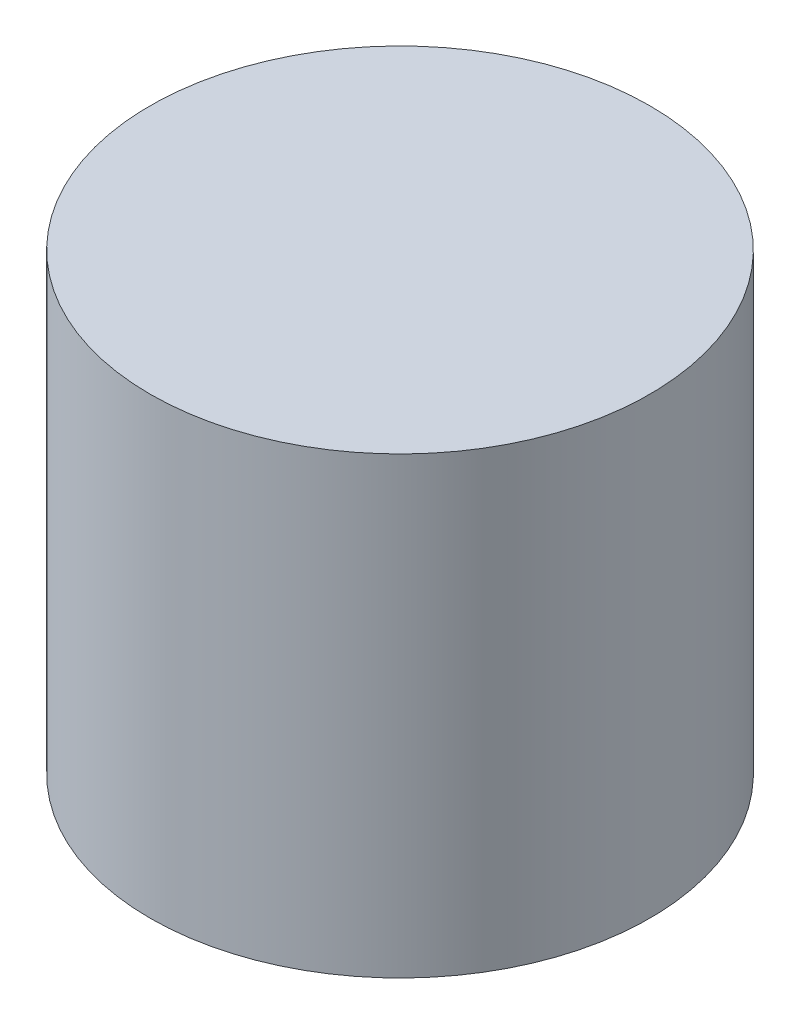
ISO-10303-21;
HEADER;
FILE_DESCRIPTION(('STEP AP214'),'2;1');
FILE_NAME('part.step','',(''),(''),'','','');
FILE_SCHEMA(('AUTOMOTIVE_DESIGN { 1 0 10303 214 1 1 1 1 }'));
ENDSEC;
DATA;
#1=APPLICATION_CONTEXT('core data for automotive mechanical design processes');
#2=APPLICATION_PROTOCOL_DEFINITION('international standard','automotive_design',2000,#1);
#3=PRODUCT_CONTEXT('',#1,'mechanical');
#4=PRODUCT('Part','Part','',(#3));
#5=PRODUCT_RELATED_PRODUCT_CATEGORY('part','',(#4));
#6=PRODUCT_DEFINITION_FORMATION('','',#4);
#7=PRODUCT_DEFINITION_CONTEXT('part definition',#1,'design');
#8=PRODUCT_DEFINITION('design','',#6,#7);
#9=PRODUCT_DEFINITION_SHAPE('','',#8);
#10=(LENGTH_UNIT() NAMED_UNIT(*) SI_UNIT(.MILLI.,.METRE.));
#11=(NAMED_UNIT(*) PLANE_ANGLE_UNIT() SI_UNIT($,.RADIAN.));
#12=(NAMED_UNIT(*) SI_UNIT($,.STERADIAN.) SOLID_ANGLE_UNIT());
#13=UNCERTAINTY_MEASURE_WITH_UNIT(LENGTH_MEASURE(1.E-05),#10,'distance_accuracy_value','');
#14=(GEOMETRIC_REPRESENTATION_CONTEXT(3) GLOBAL_UNCERTAINTY_ASSIGNED_CONTEXT((#13)) GLOBAL_UNIT_ASSIGNED_CONTEXT((#10,
#11,#12)) REPRESENTATION_CONTEXT('',''));
#15=CARTESIAN_POINT('',(0.,0.,0.));
#16=DIRECTION('',(0.,0.,1.));
#17=DIRECTION('',(1.,0.,0.));
#18=AXIS2_PLACEMENT_3D('',#15,#16,#17);
#19=CARTESIAN_POINT('',(0.,76.2,0.));
#20=DIRECTION('',(0.,-1.,0.));
#21=DIRECTION('',(0.,0.,-1.));
#22=AXIS2_PLACEMENT_3D('',#19,#20,#21);
#23=CYLINDRICAL_SURFACE('',#22,41.9482506122302);
#24=CARTESIAN_POINT('',(0.,76.2,0.));
#25=DIRECTION('',(0.,1.,0.));
#26=DIRECTION('',(0.,0.,1.));
#27=AXIS2_PLACEMENT_3D('',#24,#25,#26);
#28=CIRCLE('',#27,41.9482506122302);
#29=CARTESIAN_POINT('',(0.,76.2,-41.9482506122302));
#30=VERTEX_POINT('',#29);
#31=EDGE_CURVE('E10',#30,#30,#28,.T.);
#32=CARTESIAN_POINT('',(0.,0.,0.));
#33=DIRECTION('',(0.,1.,0.));
#34=DIRECTION('',(0.,0.,1.));
#35=AXIS2_PLACEMENT_3D('',#32,#33,#34);
#36=CIRCLE('',#35,41.9482506122302);
#37=CARTESIAN_POINT('',(0.,0.,-41.9482506122302));
#38=VERTEX_POINT('',#37);
#39=EDGE_CURVE('E34',#38,#38,#36,.T.);
#40=CARTESIAN_POINT('',(0.,76.2,-41.9482506122302));
#41=CARTESIAN_POINT('',(0.,75.40625,-41.9482506122302));
#42=CARTESIAN_POINT('',(0.,74.6125,-41.9482506122302));
#43=CARTESIAN_POINT('',(0.,73.025,-41.9482506122302));
#44=CARTESIAN_POINT('',(0.,72.23125,-41.9482506122302));
#45=CARTESIAN_POINT('',(0.,70.64375,-41.9482506122302));
#46=CARTESIAN_POINT('',(0.,69.85,-41.9482506122302));
#47=CARTESIAN_POINT('',(0.,68.2625,-41.9482506122302));
#48=CARTESIAN_POINT('',(0.,67.46875,-41.9482506122302));
#49=CARTESIAN_POINT('',(0.,65.88125,-41.9482506122302));
#50=CARTESIAN_POINT('',(0.,65.0875,-41.9482506122302));
#51=CARTESIAN_POINT('',(0.,63.5,-41.9482506122302));
#52=CARTESIAN_POINT('',(0.,62.70625,-41.9482506122302));
#53=CARTESIAN_POINT('',(0.,61.11875,-41.9482506122302));
#54=CARTESIAN_POINT('',(0.,60.325,-41.9482506122302));
#55=CARTESIAN_POINT('',(0.,58.7375,-41.9482506122302));
#56=CARTESIAN_POINT('',(0.,57.94375,-41.9482506122302));
#57=CARTESIAN_POINT('',(0.,56.35625,-41.9482506122302));
#58=CARTESIAN_POINT('',(0.,55.5625,-41.9482506122302));
#59=CARTESIAN_POINT('',(0.,53.975,-41.9482506122302));
#60=CARTESIAN_POINT('',(0.,53.18125,-41.9482506122302));
#61=CARTESIAN_POINT('',(0.,51.59375,-41.9482506122302));
#62=CARTESIAN_POINT('',(0.,50.8,-41.9482506122302));
#63=CARTESIAN_POINT('',(0.,49.2125,-41.9482506122302));
#64=CARTESIAN_POINT('',(0.,48.41875,-41.9482506122302));
#65=CARTESIAN_POINT('',(0.,46.83125,-41.9482506122302));
#66=CARTESIAN_POINT('',(0.,46.0375,-41.9482506122302));
#67=CARTESIAN_POINT('',(0.,44.45,-41.9482506122302));
#68=CARTESIAN_POINT('',(0.,43.65625,-41.9482506122302));
#69=CARTESIAN_POINT('',(0.,42.06875,-41.9482506122302));
#70=CARTESIAN_POINT('',(0.,41.275,-41.9482506122302));
#71=CARTESIAN_POINT('',(0.,39.6875,-41.9482506122302));
#72=CARTESIAN_POINT('',(0.,38.89375,-41.9482506122302));
#73=CARTESIAN_POINT('',(0.,37.30625,-41.9482506122302));
#74=CARTESIAN_POINT('',(0.,36.5125,-41.9482506122302));
#75=CARTESIAN_POINT('',(0.,34.925,-41.9482506122302));
#76=CARTESIAN_POINT('',(0.,34.13125,-41.9482506122302));
#77=CARTESIAN_POINT('',(0.,32.54375,-41.9482506122302));
#78=CARTESIAN_POINT('',(0.,31.75,-41.9482506122302));
#79=CARTESIAN_POINT('',(0.,30.1625,-41.9482506122302));
#80=CARTESIAN_POINT('',(0.,29.36875,-41.9482506122302));
#81=CARTESIAN_POINT('',(0.,27.78125,-41.9482506122302));
#82=CARTESIAN_POINT('',(0.,26.9875,-41.9482506122302));
#83=CARTESIAN_POINT('',(0.,25.4,-41.9482506122302));
#84=CARTESIAN_POINT('',(0.,24.60625,-41.9482506122302));
#85=CARTESIAN_POINT('',(0.,23.01875,-41.9482506122302));
#86=CARTESIAN_POINT('',(0.,22.225,-41.9482506122302));
#87=CARTESIAN_POINT('',(0.,20.6375,-41.9482506122302));
#88=CARTESIAN_POINT('',(0.,19.84375,-41.9482506122302));
#89=CARTESIAN_POINT('',(0.,18.25625,-41.9482506122302));
#90=CARTESIAN_POINT('',(0.,17.4625,-41.9482506122302));
#91=CARTESIAN_POINT('',(0.,15.875,-41.9482506122302));
#92=CARTESIAN_POINT('',(0.,15.08125,-41.9482506122302));
#93=CARTESIAN_POINT('',(0.,13.49375,-41.9482506122302));
#94=CARTESIAN_POINT('',(0.,12.7,-41.9482506122302));
#95=CARTESIAN_POINT('',(0.,11.1125,-41.9482506122302));
#96=CARTESIAN_POINT('',(0.,10.31875,-41.9482506122302));
#97=CARTESIAN_POINT('',(0.,8.73125,-41.9482506122302));
#98=CARTESIAN_POINT('',(0.,7.93750000000001,-41.9482506122302));
#99=CARTESIAN_POINT('',(0.,6.35,-41.9482506122302));
#100=CARTESIAN_POINT('',(0.,5.55625,-41.9482506122302));
#101=CARTESIAN_POINT('',(0.,3.96875,-41.9482506122302));
#102=CARTESIAN_POINT('',(0.,3.175,-41.9482506122302));
#103=CARTESIAN_POINT('',(0.,1.5875,-41.9482506122302));
#104=CARTESIAN_POINT('',(0.,0.793750000000001,-41.9482506122302));
#105=CARTESIAN_POINT('',(0.,0.,-41.9482506122302));
#106=B_SPLINE_CURVE_WITH_KNOTS('',3,(#40,#41,#42,#43,#44,#45,#46,#47,#48,#49,#50,#51,#52,#53,
#54,#55,#56,#57,#58,#59,#60,#61,#62,#63,#64,#65,#66,#67,#68,#69,#70,#71,#72,#73,#74,#75,#76,#77,
#78,#79,#80,#81,#82,#83,#84,#85,#86,#87,#88,#89,#90,#91,#92,#93,#94,#95,#96,#97,#98,#99,#100,
#101,#102,#103,#104,#105),.UNSPECIFIED.,.F.,.F.,(4,2,2,2,2,2,2,2,2,2,2,2,2,2,2,2,2,2,2,2,2,2,2,
2,2,2,2,2,2,2,2,2,4),(0.,2.38124999999999,4.76249999999999,7.14374999999999,9.52499999999999,
11.90625,14.2875,16.66875,19.05,21.43125,23.8125,26.19375,28.575,30.95625,33.3375,35.71875,38.1,
40.48125,42.8625,45.24375,47.625,50.00625,52.3875,54.76875,57.15,59.53125,61.9125,64.29375,
66.675,69.05625,71.4375,73.81875,76.2),.UNSPECIFIED.);
#107=EDGE_CURVE('BSEAM31',#30,#38,#106,.T.);
#108=ORIENTED_EDGE('',*,*,#31,.F.);
#109=ORIENTED_EDGE('',*,*,#39,.T.);
#110=ORIENTED_EDGE('',*,*,#107,.T.);
#111=ORIENTED_EDGE('',*,*,#107,.F.);
#112=EDGE_LOOP('',(#108,#110,#109,#111));
#113=FACE_BOUND('',#112,.T.);
#114=ADVANCED_FACE('F31',(#113),#23,.T.);
#115=CARTESIAN_POINT('',(0.,76.2,0.));
#116=DIRECTION('',(0.,1.,0.));
#117=DIRECTION('',(0.,0.,1.));
#118=AXIS2_PLACEMENT_3D('',#115,#116,#117);
#119=PLANE('',#118);
#120=ORIENTED_EDGE('',*,*,#31,.T.);
#121=EDGE_LOOP('',(#120));
#122=FACE_BOUND('',#121,.T.);
#123=ADVANCED_FACE('F46',(#122),#119,.T.);
#124=CARTESIAN_POINT('',(0.,0.,0.));
#125=DIRECTION('',(0.,1.,0.));
#126=DIRECTION('',(0.,0.,1.));
#127=AXIS2_PLACEMENT_3D('',#124,#125,#126);
#128=PLANE('',#127);
#129=ORIENTED_EDGE('',*,*,#39,.F.);
#130=EDGE_LOOP('',(#129));
#131=FACE_BOUND('',#130,.T.);
#132=ADVANCED_FACE('F44',(#131),#128,.F.);
#133=CLOSED_SHELL('',(#114,#123,#132));
#134=MANIFOLD_SOLID_BREP('B2',#133);
#135=ADVANCED_BREP_SHAPE_REPRESENTATION('',(#18,#134),#14);
#136=SHAPE_DEFINITION_REPRESENTATION(#9,#135);
ENDSEC;
END-ISO-10303-21;
